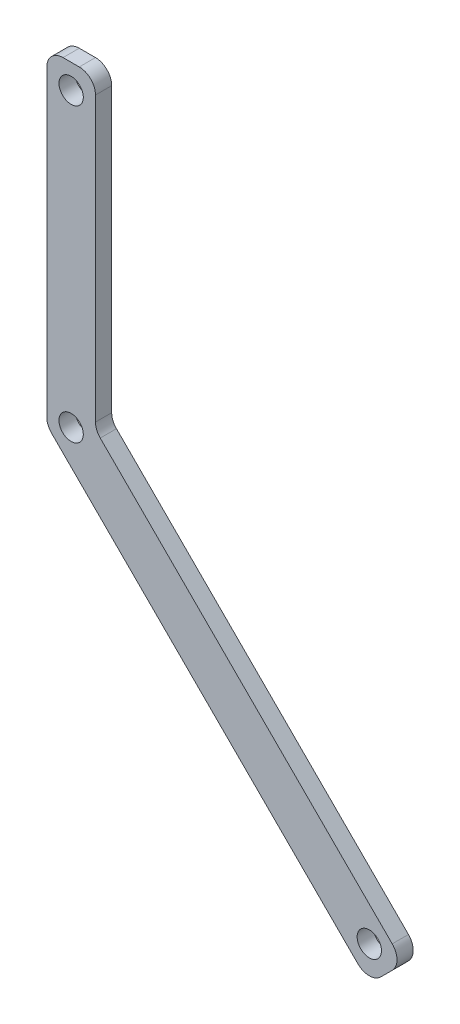
ISO-10303-21;
HEADER;
FILE_DESCRIPTION(('STEP AP214'),'2;1');
FILE_NAME('part.step','',(''),(''),'','','');
FILE_SCHEMA(('AUTOMOTIVE_DESIGN { 1 0 10303 214 1 1 1 1 }'));
ENDSEC;
DATA;
#1=APPLICATION_CONTEXT('core data for automotive mechanical design processes');
#2=APPLICATION_PROTOCOL_DEFINITION('international standard','automotive_design',2000,#1);
#3=PRODUCT_CONTEXT('',#1,'mechanical');
#4=PRODUCT('Part','Part','',(#3));
#5=PRODUCT_RELATED_PRODUCT_CATEGORY('part','',(#4));
#6=PRODUCT_DEFINITION_FORMATION('','',#4);
#7=PRODUCT_DEFINITION_CONTEXT('part definition',#1,'design');
#8=PRODUCT_DEFINITION('design','',#6,#7);
#9=PRODUCT_DEFINITION_SHAPE('','',#8);
#10=(LENGTH_UNIT() NAMED_UNIT(*) SI_UNIT(.MILLI.,.METRE.));
#11=(NAMED_UNIT(*) PLANE_ANGLE_UNIT() SI_UNIT($,.RADIAN.));
#12=(NAMED_UNIT(*) SI_UNIT($,.STERADIAN.) SOLID_ANGLE_UNIT());
#13=UNCERTAINTY_MEASURE_WITH_UNIT(LENGTH_MEASURE(1.E-05),#10,'distance_accuracy_value','');
#14=(GEOMETRIC_REPRESENTATION_CONTEXT(3) GLOBAL_UNCERTAINTY_ASSIGNED_CONTEXT((#13)) GLOBAL_UNIT_ASSIGNED_CONTEXT((#10,
#11,#12)) REPRESENTATION_CONTEXT('',''));
#15=CARTESIAN_POINT('',(0.,0.,0.));
#16=DIRECTION('',(0.,0.,1.));
#17=DIRECTION('',(1.,0.,0.));
#18=AXIS2_PLACEMENT_3D('',#15,#16,#17);
#19=CARTESIAN_POINT('',(-11.1213203435597,-11.1213203435596,2.));
#20=DIRECTION('',(-0.707106781186551,-0.707106781186544,0.));
#21=DIRECTION('',(0.707106781186544,-0.707106781186551,0.));
#22=AXIS2_PLACEMENT_3D('',#19,#20,#21);
#23=PLANE('',#22);
#24=DIRECTION('',(-0.707106781186544,0.707106781186551,0.));
#25=VECTOR('',#24,1.);
#26=CARTESIAN_POINT('',(-11.1213203435597,-11.1213203435596,0.));
#27=LINE('',#26,#25);
#28=CARTESIAN_POINT('',(35.3553390593272,-57.5979797464469,0.));
#29=VERTEX_POINT('',#28);
#30=CARTESIAN_POINT('',(-2.4142135623731,-19.8284271247462,0.));
#31=VERTEX_POINT('',#30);
#32=EDGE_CURVE('E153',#29,#31,#27,.T.);
#33=ORIENTED_EDGE('',*,*,#32,.F.);
#34=DIRECTION('',(0.,0.,-1.));
#35=VECTOR('',#34,1.);
#36=CARTESIAN_POINT('',(35.3553390593271,-57.5979797464469,2.));
#37=LINE('',#36,#35);
#38=CARTESIAN_POINT('',(35.3553390593272,-57.5979797464469,2.));
#39=VERTEX_POINT('',#38);
#40=EDGE_CURVE('E130',#29,#39,#37,.F.);
#41=ORIENTED_EDGE('',*,*,#40,.T.);
#42=DIRECTION('',(-0.707106781186544,0.707106781186551,0.));
#43=VECTOR('',#42,1.);
#44=CARTESIAN_POINT('',(-11.1213203435597,-11.1213203435596,2.));
#45=LINE('',#44,#43);
#46=CARTESIAN_POINT('',(-2.4142135623731,-19.8284271247462,2.));
#47=VERTEX_POINT('',#46);
#48=EDGE_CURVE('E178',#39,#47,#45,.T.);
#49=ORIENTED_EDGE('',*,*,#48,.T.);
#50=DIRECTION('',(0.,0.,-1.));
#51=VECTOR('',#50,1.);
#52=CARTESIAN_POINT('',(-2.4142135623731,-19.8284271247462,2.));
#53=LINE('',#52,#51);
#54=EDGE_CURVE('E135',#47,#31,#53,.T.);
#55=ORIENTED_EDGE('',*,*,#54,.T.);
#56=EDGE_LOOP('',(#33,#41,#49,#55));
#57=FACE_BOUND('',#56,.T.);
#58=ADVANCED_FACE('F35',(#57),#23,.T.);
#59=CARTESIAN_POINT('',(47.8908729652599,-47.8908729652604,2.));
#60=DIRECTION('',(-0.707106781186544,0.707106781186551,0.));
#61=DIRECTION('',(-0.707106781186551,-0.707106781186544,0.));
#62=AXIS2_PLACEMENT_3D('',#59,#60,#61);
#63=PLANE('',#62);
#64=DIRECTION('',(0.707106781186551,0.707106781186544,0.));
#65=VECTOR('',#64,1.);
#66=CARTESIAN_POINT('',(47.8908729652599,-47.8908729652604,2.));
#67=LINE('',#66,#65);
#68=CARTESIAN_POINT('',(38.1837661840733,-57.5979797464469,2.));
#69=VERTEX_POINT('',#68);
#70=CARTESIAN_POINT('',(39.5979797464464,-56.1837661840738,2.));
#71=VERTEX_POINT('',#70);
#72=EDGE_CURVE('E145',#69,#71,#67,.T.);
#73=ORIENTED_EDGE('',*,*,#72,.F.);
#74=DIRECTION('',(0.,0.,-1.));
#75=VECTOR('',#74,1.);
#76=CARTESIAN_POINT('',(38.1837661840733,-57.5979797464469,0.));
#77=LINE('',#76,#75);
#78=CARTESIAN_POINT('',(38.1837661840733,-57.5979797464469,0.));
#79=VERTEX_POINT('',#78);
#80=EDGE_CURVE('E129',#69,#79,#77,.T.);
#81=ORIENTED_EDGE('',*,*,#80,.T.);
#82=DIRECTION('',(0.707106781186551,0.707106781186544,0.));
#83=VECTOR('',#82,1.);
#84=CARTESIAN_POINT('',(47.8908729652599,-47.8908729652604,0.));
#85=LINE('',#84,#83);
#86=CARTESIAN_POINT('',(39.5979797464464,-56.1837661840738,0.));
#87=VERTEX_POINT('',#86);
#88=EDGE_CURVE('E142',#79,#87,#85,.T.);
#89=ORIENTED_EDGE('',*,*,#88,.T.);
#90=DIRECTION('',(0.,0.,-1.));
#91=VECTOR('',#90,1.);
#92=CARTESIAN_POINT('',(39.5979797464464,-56.1837661840738,2.));
#93=LINE('',#92,#91);
#94=EDGE_CURVE('E147',#87,#71,#93,.F.);
#95=ORIENTED_EDGE('',*,*,#94,.T.);
#96=EDGE_LOOP('',(#73,#81,#89,#95));
#97=FACE_BOUND('',#96,.T.);
#98=ADVANCED_FACE('F141',(#97),#63,.F.);
#99=CARTESIAN_POINT('',(-6.87867965644036,-6.87867965644029,2.));
#100=DIRECTION('',(-0.707106781186551,-0.707106781186544,0.));
#101=DIRECTION('',(0.707106781186544,-0.707106781186551,0.));
#102=AXIS2_PLACEMENT_3D('',#99,#100,#101);
#103=PLANE('',#102);
#104=DIRECTION('',(-0.707106781186544,0.707106781186551,0.));
#105=VECTOR('',#104,1.);
#106=CARTESIAN_POINT('',(-6.87867965644036,-6.87867965644029,2.));
#107=LINE('',#106,#105);
#108=CARTESIAN_POINT('',(39.5979797464464,-53.3553390593276,2.));
#109=VERTEX_POINT('',#108);
#110=CARTESIAN_POINT('',(3.5857864376269,-17.3431457505077,2.));
#111=VERTEX_POINT('',#110);
#112=EDGE_CURVE('E235',#109,#111,#107,.T.);
#113=ORIENTED_EDGE('',*,*,#112,.F.);
#114=DIRECTION('',(0.,0.,-1.));
#115=VECTOR('',#114,1.);
#116=CARTESIAN_POINT('',(39.5979797464464,-53.3553390593276,2.));
#117=LINE('',#116,#115);
#118=CARTESIAN_POINT('',(39.5979797464464,-53.3553390593276,0.));
#119=VERTEX_POINT('',#118);
#120=EDGE_CURVE('E201',#109,#119,#117,.T.);
#121=ORIENTED_EDGE('',*,*,#120,.T.);
#122=DIRECTION('',(-0.707106781186544,0.707106781186551,0.));
#123=VECTOR('',#122,1.);
#124=CARTESIAN_POINT('',(-6.87867965644036,-6.87867965644029,0.));
#125=LINE('',#124,#123);
#126=CARTESIAN_POINT('',(3.5857864376269,-17.3431457505077,0.));
#127=VERTEX_POINT('',#126);
#128=EDGE_CURVE('E152',#119,#127,#125,.T.);
#129=ORIENTED_EDGE('',*,*,#128,.T.);
#130=DIRECTION('',(0.,0.,-1.));
#131=VECTOR('',#130,1.);
#132=CARTESIAN_POINT('',(3.5857864376269,-17.3431457505077,2.));
#133=LINE('',#132,#131);
#134=EDGE_CURVE('E199',#127,#111,#133,.F.);
#135=ORIENTED_EDGE('',*,*,#134,.T.);
#136=EDGE_LOOP('',(#113,#121,#129,#135));
#137=FACE_BOUND('',#136,.T.);
#138=ADVANCED_FACE('F223',(#137),#103,.F.);
#139=CARTESIAN_POINT('',(3.,0.,2.));
#140=DIRECTION('',(-1.,0.,0.));
#141=DIRECTION('',(0.,0.,1.));
#142=AXIS2_PLACEMENT_3D('',#139,#140,#141);
#143=PLANE('',#142);
#144=DIRECTION('',(0.,1.,0.));
#145=VECTOR('',#144,1.);
#146=CARTESIAN_POINT('',(3.,0.,2.));
#147=LINE('',#146,#145);
#148=CARTESIAN_POINT('',(3.,-15.9289321881346,2.));
#149=VERTEX_POINT('',#148);
#150=CARTESIAN_POINT('',(3.,19.,2.));
#151=VERTEX_POINT('',#150);
#152=EDGE_CURVE('E233',#149,#151,#147,.T.);
#153=ORIENTED_EDGE('',*,*,#152,.F.);
#154=DIRECTION('',(0.,0.,-1.));
#155=VECTOR('',#154,1.);
#156=CARTESIAN_POINT('',(3.,-15.9289321881346,0.));
#157=LINE('',#156,#155);
#158=CARTESIAN_POINT('',(3.,-15.9289321881346,0.));
#159=VERTEX_POINT('',#158);
#160=EDGE_CURVE('E210',#149,#159,#157,.T.);
#161=ORIENTED_EDGE('',*,*,#160,.T.);
#162=DIRECTION('',(0.,1.,0.));
#163=VECTOR('',#162,1.);
#164=CARTESIAN_POINT('',(3.,0.,0.));
#165=LINE('',#164,#163);
#166=CARTESIAN_POINT('',(3.,19.,0.));
#167=VERTEX_POINT('',#166);
#168=EDGE_CURVE('E156',#159,#167,#165,.T.);
#169=ORIENTED_EDGE('',*,*,#168,.T.);
#170=DIRECTION('',(0.,0.,-1.));
#171=VECTOR('',#170,1.);
#172=CARTESIAN_POINT('',(3.,19.,2.));
#173=LINE('',#172,#171);
#174=EDGE_CURVE('E208',#167,#151,#173,.F.);
#175=ORIENTED_EDGE('',*,*,#174,.T.);
#176=EDGE_LOOP('',(#153,#161,#169,#175));
#177=FACE_BOUND('',#176,.T.);
#178=ADVANCED_FACE('F237',(#177),#143,.F.);
#179=CARTESIAN_POINT('',(0.,21.,2.));
#180=DIRECTION('',(0.,1.,0.));
#181=DIRECTION('',(0.,0.,1.));
#182=AXIS2_PLACEMENT_3D('',#179,#180,#181);
#183=PLANE('',#182);
#184=DIRECTION('',(1.,0.,0.));
#185=VECTOR('',#184,1.);
#186=CARTESIAN_POINT('',(0.,21.,0.));
#187=LINE('',#186,#185);
#188=CARTESIAN_POINT('',(-1.,21.,0.));
#189=VERTEX_POINT('',#188);
#190=CARTESIAN_POINT('',(0.999999999999999,21.,0.));
#191=VERTEX_POINT('',#190);
#192=EDGE_CURVE('E163',#189,#191,#187,.T.);
#193=ORIENTED_EDGE('',*,*,#192,.F.);
#194=DIRECTION('',(0.,0.,-1.));
#195=VECTOR('',#194,1.);
#196=CARTESIAN_POINT('',(-1.,21.,2.));
#197=LINE('',#196,#195);
#198=CARTESIAN_POINT('',(-1.,21.,2.));
#199=VERTEX_POINT('',#198);
#200=EDGE_CURVE('E216',#189,#199,#197,.F.);
#201=ORIENTED_EDGE('',*,*,#200,.T.);
#202=DIRECTION('',(1.,0.,0.));
#203=VECTOR('',#202,1.);
#204=CARTESIAN_POINT('',(0.,21.,2.));
#205=LINE('',#204,#203);
#206=CARTESIAN_POINT('',(0.999999999999999,21.,2.));
#207=VERTEX_POINT('',#206);
#208=EDGE_CURVE('E239',#199,#207,#205,.T.);
#209=ORIENTED_EDGE('',*,*,#208,.T.);
#210=DIRECTION('',(0.,0.,-1.));
#211=VECTOR('',#210,1.);
#212=CARTESIAN_POINT('',(0.999999999999999,21.,0.));
#213=LINE('',#212,#211);
#214=EDGE_CURVE('E213',#207,#191,#213,.T.);
#215=ORIENTED_EDGE('',*,*,#214,.T.);
#216=EDGE_LOOP('',(#193,#201,#209,#215));
#217=FACE_BOUND('',#216,.T.);
#218=ADVANCED_FACE('F304',(#217),#183,.T.);
#219=CARTESIAN_POINT('',(0.,-18.,2.));
#220=DIRECTION('',(0.,0.,-1.));
#221=DIRECTION('',(-1.,0.,0.));
#222=AXIS2_PLACEMENT_3D('',#219,#220,#221);
#223=CYLINDRICAL_SURFACE('',#222,1.5);
#224=CARTESIAN_POINT('',(0.,-18.,2.));
#225=DIRECTION('',(0.,0.,1.));
#226=DIRECTION('',(1.,0.,0.));
#227=AXIS2_PLACEMENT_3D('',#224,#225,#226);
#228=CIRCLE('',#227,1.5);
#229=CARTESIAN_POINT('',(1.49999999999999,-18.,2.));
#230=VERTEX_POINT('',#229);
#231=EDGE_CURVE('E251',#230,#230,#228,.T.);
#232=ORIENTED_EDGE('',*,*,#231,.T.);
#233=EDGE_LOOP('',(#232));
#234=FACE_BOUND('',#233,.T.);
#235=CARTESIAN_POINT('',(0.,-18.,0.));
#236=DIRECTION('',(0.,0.,1.));
#237=DIRECTION('',(1.,0.,0.));
#238=AXIS2_PLACEMENT_3D('',#235,#236,#237);
#239=CIRCLE('',#238,1.5);
#240=CARTESIAN_POINT('',(1.49999999999999,-18.,0.));
#241=VERTEX_POINT('',#240);
#242=EDGE_CURVE('E172',#241,#241,#239,.T.);
#243=ORIENTED_EDGE('',*,*,#242,.F.);
#244=EDGE_LOOP('',(#243));
#245=FACE_BOUND('',#244,.T.);
#246=ADVANCED_FACE('F307',(#234,#245),#223,.F.);
#247=CARTESIAN_POINT('',(36.7695526217003,-54.7695526217007,2.));
#248=DIRECTION('',(0.,0.,-1.));
#249=DIRECTION('',(-1.,0.,0.));
#250=AXIS2_PLACEMENT_3D('',#247,#248,#249);
#251=CYLINDRICAL_SURFACE('',#250,1.5);
#252=CARTESIAN_POINT('',(36.7695526217003,-54.7695526217007,2.));
#253=DIRECTION('',(0.,0.,1.));
#254=DIRECTION('',(1.,0.,0.));
#255=AXIS2_PLACEMENT_3D('',#252,#253,#254);
#256=CIRCLE('',#255,1.5);
#257=CARTESIAN_POINT('',(38.2695526217003,-54.7695526217007,2.));
#258=VERTEX_POINT('',#257);
#259=EDGE_CURVE('E248',#258,#258,#256,.T.);
#260=ORIENTED_EDGE('',*,*,#259,.T.);
#261=EDGE_LOOP('',(#260));
#262=FACE_BOUND('',#261,.T.);
#263=CARTESIAN_POINT('',(36.7695526217003,-54.7695526217007,0.));
#264=DIRECTION('',(0.,0.,1.));
#265=DIRECTION('',(1.,0.,0.));
#266=AXIS2_PLACEMENT_3D('',#263,#264,#265);
#267=CIRCLE('',#266,1.5);
#268=CARTESIAN_POINT('',(38.2695526217003,-54.7695526217007,0.));
#269=VERTEX_POINT('',#268);
#270=EDGE_CURVE('E169',#269,#269,#267,.T.);
#271=ORIENTED_EDGE('',*,*,#270,.F.);
#272=EDGE_LOOP('',(#271));
#273=FACE_BOUND('',#272,.T.);
#274=ADVANCED_FACE('F313',(#262,#273),#251,.F.);
#275=CARTESIAN_POINT('',(-3.,0.,2.));
#276=DIRECTION('',(-1.,0.,0.));
#277=DIRECTION('',(0.,0.,1.));
#278=AXIS2_PLACEMENT_3D('',#275,#276,#277);
#279=PLANE('',#278);
#280=DIRECTION('',(0.,1.,0.));
#281=VECTOR('',#280,1.);
#282=CARTESIAN_POINT('',(-3.,0.,0.));
#283=LINE('',#282,#281);
#284=CARTESIAN_POINT('',(-3.,-18.4142135623731,0.));
#285=VERTEX_POINT('',#284);
#286=CARTESIAN_POINT('',(-3.,19.,0.));
#287=VERTEX_POINT('',#286);
#288=EDGE_CURVE('E166',#285,#287,#283,.T.);
#289=ORIENTED_EDGE('',*,*,#288,.F.);
#290=DIRECTION('',(0.,0.,-1.));
#291=VECTOR('',#290,1.);
#292=CARTESIAN_POINT('',(-3.,-18.4142135623731,2.));
#293=LINE('',#292,#291);
#294=CARTESIAN_POINT('',(-3.,-18.4142135623731,2.));
#295=VERTEX_POINT('',#294);
#296=EDGE_CURVE('E57',#285,#295,#293,.F.);
#297=ORIENTED_EDGE('',*,*,#296,.T.);
#298=DIRECTION('',(0.,1.,0.));
#299=VECTOR('',#298,1.);
#300=CARTESIAN_POINT('',(-3.,0.,2.));
#301=LINE('',#300,#299);
#302=CARTESIAN_POINT('',(-3.,19.,2.));
#303=VERTEX_POINT('',#302);
#304=EDGE_CURVE('E242',#295,#303,#301,.T.);
#305=ORIENTED_EDGE('',*,*,#304,.T.);
#306=DIRECTION('',(0.,0.,-1.));
#307=VECTOR('',#306,1.);
#308=CARTESIAN_POINT('',(-3.,19.,2.));
#309=LINE('',#308,#307);
#310=EDGE_CURVE('E204',#303,#287,#309,.T.);
#311=ORIENTED_EDGE('',*,*,#310,.T.);
#312=EDGE_LOOP('',(#289,#297,#305,#311));
#313=FACE_BOUND('',#312,.T.);
#314=ADVANCED_FACE('F266',(#313),#279,.T.);
#315=CARTESIAN_POINT('',(0.,18.,2.));
#316=DIRECTION('',(0.,0.,-1.));
#317=DIRECTION('',(-1.,0.,0.));
#318=AXIS2_PLACEMENT_3D('',#315,#316,#317);
#319=CYLINDRICAL_SURFACE('',#318,1.5);
#320=CARTESIAN_POINT('',(0.,18.,2.));
#321=DIRECTION('',(0.,0.,1.));
#322=DIRECTION('',(1.,0.,0.));
#323=AXIS2_PLACEMENT_3D('',#320,#321,#322);
#324=CIRCLE('',#323,1.5);
#325=CARTESIAN_POINT('',(1.49999999999999,18.,2.));
#326=VERTEX_POINT('',#325);
#327=EDGE_CURVE('E179',#326,#326,#324,.T.);
#328=ORIENTED_EDGE('',*,*,#327,.T.);
#329=EDGE_LOOP('',(#328));
#330=FACE_BOUND('',#329,.T.);
#331=CARTESIAN_POINT('',(0.,18.,0.));
#332=DIRECTION('',(0.,0.,1.));
#333=DIRECTION('',(1.,0.,0.));
#334=AXIS2_PLACEMENT_3D('',#331,#332,#333);
#335=CIRCLE('',#334,1.5);
#336=CARTESIAN_POINT('',(1.49999999999999,18.,0.));
#337=VERTEX_POINT('',#336);
#338=EDGE_CURVE('E175',#337,#337,#335,.T.);
#339=ORIENTED_EDGE('',*,*,#338,.F.);
#340=EDGE_LOOP('',(#339));
#341=FACE_BOUND('',#340,.T.);
#342=ADVANCED_FACE('F256',(#330,#341),#319,.F.);
#343=CARTESIAN_POINT('',(0.,0.,2.));
#344=DIRECTION('',(0.,0.,1.));
#345=DIRECTION('',(1.,0.,0.));
#346=AXIS2_PLACEMENT_3D('',#343,#344,#345);
#347=PLANE('',#346);
#348=ORIENTED_EDGE('',*,*,#48,.F.);
#349=CARTESIAN_POINT('',(36.7695526217002,-56.1837661840738,2.));
#350=DIRECTION('',(0.,0.,1.));
#351=DIRECTION('',(1.,0.,0.));
#352=AXIS2_PLACEMENT_3D('',#349,#350,#351);
#353=CIRCLE('',#352,2.);
#354=EDGE_CURVE('E197',#39,#69,#353,.T.);
#355=ORIENTED_EDGE('',*,*,#354,.T.);
#356=ORIENTED_EDGE('',*,*,#72,.T.);
#357=CARTESIAN_POINT('',(38.1837661840733,-54.7695526217007,2.));
#358=DIRECTION('',(0.,0.,1.));
#359=DIRECTION('',(1.,0.,0.));
#360=AXIS2_PLACEMENT_3D('',#357,#358,#359);
#361=CIRCLE('',#360,2.);
#362=EDGE_CURVE('E195',#71,#109,#361,.T.);
#363=ORIENTED_EDGE('',*,*,#362,.T.);
#364=ORIENTED_EDGE('',*,*,#112,.T.);
#365=CARTESIAN_POINT('',(5.,-15.9289321881346,2.));
#366=DIRECTION('',(0.,0.,1.));
#367=DIRECTION('',(1.,0.,0.));
#368=AXIS2_PLACEMENT_3D('',#365,#366,#367);
#369=CIRCLE('',#368,2.);
#370=EDGE_CURVE('E11',#111,#149,#369,.F.);
#371=ORIENTED_EDGE('',*,*,#370,.T.);
#372=ORIENTED_EDGE('',*,*,#152,.T.);
#373=CARTESIAN_POINT('',(0.999999999999999,19.,2.));
#374=DIRECTION('',(0.,0.,1.));
#375=DIRECTION('',(1.,0.,0.));
#376=AXIS2_PLACEMENT_3D('',#373,#374,#375);
#377=CIRCLE('',#376,2.);
#378=EDGE_CURVE('E190',#151,#207,#377,.T.);
#379=ORIENTED_EDGE('',*,*,#378,.T.);
#380=ORIENTED_EDGE('',*,*,#208,.F.);
#381=CARTESIAN_POINT('',(-1.,19.,2.));
#382=DIRECTION('',(0.,0.,1.));
#383=DIRECTION('',(1.,0.,0.));
#384=AXIS2_PLACEMENT_3D('',#381,#382,#383);
#385=CIRCLE('',#384,2.);
#386=EDGE_CURVE('E50',#199,#303,#385,.T.);
#387=ORIENTED_EDGE('',*,*,#386,.T.);
#388=ORIENTED_EDGE('',*,*,#304,.F.);
#389=CARTESIAN_POINT('',(-1.,-18.4142135623731,2.));
#390=DIRECTION('',(0.,0.,1.));
#391=DIRECTION('',(1.,0.,0.));
#392=AXIS2_PLACEMENT_3D('',#389,#390,#391);
#393=CIRCLE('',#392,2.);
#394=EDGE_CURVE('E193',#295,#47,#393,.T.);
#395=ORIENTED_EDGE('',*,*,#394,.T.);
#396=EDGE_LOOP('',(#348,#355,#356,#363,#364,#371,#372,#379,#380,#387,#388,#395));
#397=FACE_BOUND('',#396,.T.);
#398=ORIENTED_EDGE('',*,*,#259,.F.);
#399=EDGE_LOOP('',(#398));
#400=FACE_BOUND('',#399,.T.);
#401=ORIENTED_EDGE('',*,*,#231,.F.);
#402=EDGE_LOOP('',(#401));
#403=FACE_BOUND('',#402,.T.);
#404=ORIENTED_EDGE('',*,*,#327,.F.);
#405=EDGE_LOOP('',(#404));
#406=FACE_BOUND('',#405,.T.);
#407=ADVANCED_FACE('F231',(#397,#400,#403,#406),#347,.T.);
#408=CARTESIAN_POINT('',(0.,0.,0.));
#409=DIRECTION('',(0.,0.,1.));
#410=DIRECTION('',(1.,0.,0.));
#411=AXIS2_PLACEMENT_3D('',#408,#409,#410);
#412=PLANE('',#411);
#413=ORIENTED_EDGE('',*,*,#88,.F.);
#414=CARTESIAN_POINT('',(36.7695526217002,-56.1837661840738,0.));
#415=DIRECTION('',(0.,0.,1.));
#416=DIRECTION('',(1.,0.,0.));
#417=AXIS2_PLACEMENT_3D('',#414,#415,#416);
#418=CIRCLE('',#417,2.);
#419=EDGE_CURVE('E125',#79,#29,#418,.F.);
#420=ORIENTED_EDGE('',*,*,#419,.T.);
#421=ORIENTED_EDGE('',*,*,#32,.T.);
#422=CARTESIAN_POINT('',(-1.,-18.4142135623731,0.));
#423=DIRECTION('',(0.,0.,1.));
#424=DIRECTION('',(1.,0.,0.));
#425=AXIS2_PLACEMENT_3D('',#422,#423,#424);
#426=CIRCLE('',#425,2.);
#427=EDGE_CURVE('E184',#31,#285,#426,.F.);
#428=ORIENTED_EDGE('',*,*,#427,.T.);
#429=ORIENTED_EDGE('',*,*,#288,.T.);
#430=CARTESIAN_POINT('',(-1.,19.,0.));
#431=DIRECTION('',(0.,0.,1.));
#432=DIRECTION('',(1.,0.,0.));
#433=AXIS2_PLACEMENT_3D('',#430,#431,#432);
#434=CIRCLE('',#433,2.);
#435=EDGE_CURVE('E182',#287,#189,#434,.F.);
#436=ORIENTED_EDGE('',*,*,#435,.T.);
#437=ORIENTED_EDGE('',*,*,#192,.T.);
#438=CARTESIAN_POINT('',(0.999999999999999,19.,0.));
#439=DIRECTION('',(0.,0.,1.));
#440=DIRECTION('',(1.,0.,0.));
#441=AXIS2_PLACEMENT_3D('',#438,#439,#440);
#442=CIRCLE('',#441,2.);
#443=EDGE_CURVE('E146',#191,#167,#442,.F.);
#444=ORIENTED_EDGE('',*,*,#443,.T.);
#445=ORIENTED_EDGE('',*,*,#168,.F.);
#446=CARTESIAN_POINT('',(5.,-15.9289321881346,0.));
#447=DIRECTION('',(0.,0.,1.));
#448=DIRECTION('',(1.,0.,0.));
#449=AXIS2_PLACEMENT_3D('',#446,#447,#448);
#450=CIRCLE('',#449,2.);
#451=EDGE_CURVE('E43',#159,#127,#450,.T.);
#452=ORIENTED_EDGE('',*,*,#451,.T.);
#453=ORIENTED_EDGE('',*,*,#128,.F.);
#454=CARTESIAN_POINT('',(38.1837661840733,-54.7695526217007,0.));
#455=DIRECTION('',(0.,0.,1.));
#456=DIRECTION('',(1.,0.,0.));
#457=AXIS2_PLACEMENT_3D('',#454,#455,#456);
#458=CIRCLE('',#457,2.);
#459=EDGE_CURVE('E136',#119,#87,#458,.F.);
#460=ORIENTED_EDGE('',*,*,#459,.T.);
#461=EDGE_LOOP('',(#413,#420,#421,#428,#429,#436,#437,#444,#445,#452,#453,#460));
#462=FACE_BOUND('',#461,.T.);
#463=ORIENTED_EDGE('',*,*,#270,.T.);
#464=EDGE_LOOP('',(#463));
#465=FACE_BOUND('',#464,.T.);
#466=ORIENTED_EDGE('',*,*,#242,.T.);
#467=EDGE_LOOP('',(#466));
#468=FACE_BOUND('',#467,.T.);
#469=ORIENTED_EDGE('',*,*,#338,.T.);
#470=EDGE_LOOP('',(#469));
#471=FACE_BOUND('',#470,.T.);
#472=ADVANCED_FACE('F149',(#462,#465,#468,#471),#412,.F.);
#473=CARTESIAN_POINT('',(36.7695526217002,-56.1837661840738,2.));
#474=DIRECTION('',(0.,0.,1.));
#475=DIRECTION('',(1.,0.,0.));
#476=AXIS2_PLACEMENT_3D('',#473,#474,#475);
#477=CYLINDRICAL_SURFACE('',#476,2.);
#478=ORIENTED_EDGE('',*,*,#354,.F.);
#479=ORIENTED_EDGE('',*,*,#40,.F.);
#480=ORIENTED_EDGE('',*,*,#419,.F.);
#481=ORIENTED_EDGE('',*,*,#80,.F.);
#482=EDGE_LOOP('',(#478,#479,#480,#481));
#483=FACE_BOUND('',#482,.T.);
#484=ADVANCED_FACE('F128',(#483),#477,.T.);
#485=CARTESIAN_POINT('',(38.1837661840733,-54.7695526217007,2.));
#486=DIRECTION('',(0.,0.,-1.));
#487=DIRECTION('',(-1.,0.,0.));
#488=AXIS2_PLACEMENT_3D('',#485,#486,#487);
#489=CYLINDRICAL_SURFACE('',#488,2.);
#490=ORIENTED_EDGE('',*,*,#362,.F.);
#491=ORIENTED_EDGE('',*,*,#94,.F.);
#492=ORIENTED_EDGE('',*,*,#459,.F.);
#493=ORIENTED_EDGE('',*,*,#120,.F.);
#494=EDGE_LOOP('',(#490,#491,#492,#493));
#495=FACE_BOUND('',#494,.T.);
#496=ADVANCED_FACE('F279',(#495),#489,.T.);
#497=CARTESIAN_POINT('',(-1.,-18.4142135623731,2.));
#498=DIRECTION('',(0.,0.,-1.));
#499=DIRECTION('',(-1.,0.,0.));
#500=AXIS2_PLACEMENT_3D('',#497,#498,#499);
#501=CYLINDRICAL_SURFACE('',#500,2.);
#502=ORIENTED_EDGE('',*,*,#394,.F.);
#503=ORIENTED_EDGE('',*,*,#296,.F.);
#504=ORIENTED_EDGE('',*,*,#427,.F.);
#505=ORIENTED_EDGE('',*,*,#54,.F.);
#506=EDGE_LOOP('',(#502,#503,#504,#505));
#507=FACE_BOUND('',#506,.T.);
#508=ADVANCED_FACE('F282',(#507),#501,.T.);
#509=CARTESIAN_POINT('',(5.,-15.9289321881346,2.));
#510=DIRECTION('',(0.,0.,1.));
#511=DIRECTION('',(1.,0.,0.));
#512=AXIS2_PLACEMENT_3D('',#509,#510,#511);
#513=CYLINDRICAL_SURFACE('',#512,2.);
#514=ORIENTED_EDGE('',*,*,#370,.F.);
#515=ORIENTED_EDGE('',*,*,#134,.F.);
#516=ORIENTED_EDGE('',*,*,#451,.F.);
#517=ORIENTED_EDGE('',*,*,#160,.F.);
#518=EDGE_LOOP('',(#514,#515,#516,#517));
#519=FACE_BOUND('',#518,.T.);
#520=ADVANCED_FACE('F227',(#519),#513,.F.);
#521=CARTESIAN_POINT('',(-1.,19.,2.));
#522=DIRECTION('',(0.,0.,-1.));
#523=DIRECTION('',(-1.,0.,0.));
#524=AXIS2_PLACEMENT_3D('',#521,#522,#523);
#525=CYLINDRICAL_SURFACE('',#524,2.);
#526=ORIENTED_EDGE('',*,*,#386,.F.);
#527=ORIENTED_EDGE('',*,*,#200,.F.);
#528=ORIENTED_EDGE('',*,*,#435,.F.);
#529=ORIENTED_EDGE('',*,*,#310,.F.);
#530=EDGE_LOOP('',(#526,#527,#528,#529));
#531=FACE_BOUND('',#530,.T.);
#532=ADVANCED_FACE('F288',(#531),#525,.T.);
#533=CARTESIAN_POINT('',(0.999999999999999,19.,2.));
#534=DIRECTION('',(0.,0.,1.));
#535=DIRECTION('',(1.,0.,0.));
#536=AXIS2_PLACEMENT_3D('',#533,#534,#535);
#537=CYLINDRICAL_SURFACE('',#536,2.);
#538=ORIENTED_EDGE('',*,*,#378,.F.);
#539=ORIENTED_EDGE('',*,*,#174,.F.);
#540=ORIENTED_EDGE('',*,*,#443,.F.);
#541=ORIENTED_EDGE('',*,*,#214,.F.);
#542=EDGE_LOOP('',(#538,#539,#540,#541));
#543=FACE_BOUND('',#542,.T.);
#544=ADVANCED_FACE('F37',(#543),#537,.T.);
#545=CLOSED_SHELL('',(#58,#98,#138,#178,#218,#246,#274,#314,#342,#407,#472,#484,#496,#508,#520,
#532,#544));
#546=MANIFOLD_SOLID_BREP('B2',#545);
#547=ADVANCED_BREP_SHAPE_REPRESENTATION('',(#18,#546),#14);
#548=SHAPE_DEFINITION_REPRESENTATION(#9,#547);
ENDSEC;
END-ISO-10303-21;
